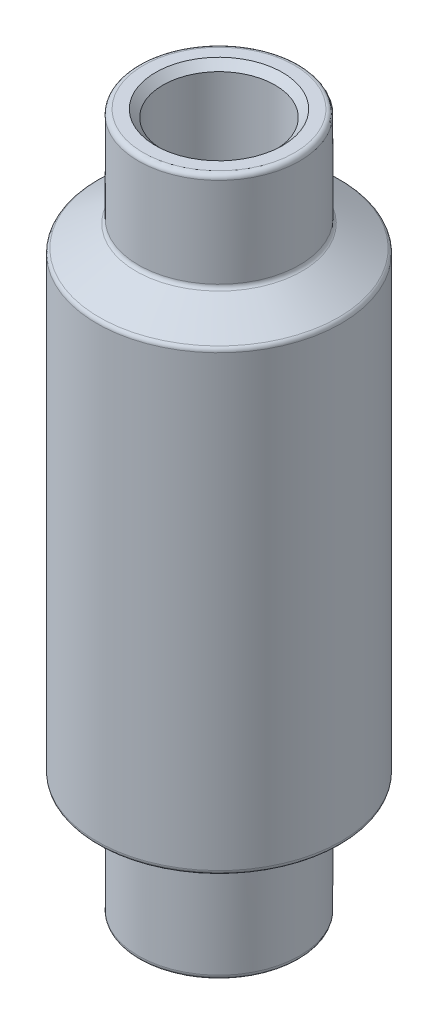
ISO-10303-21;
HEADER;
FILE_DESCRIPTION(('STEP AP214'),'2;1');
FILE_NAME('part.step','',(''),(''),'','','');
FILE_SCHEMA(('AUTOMOTIVE_DESIGN { 1 0 10303 214 1 1 1 1 }'));
ENDSEC;
DATA;
#1=APPLICATION_CONTEXT('core data for automotive mechanical design processes');
#2=APPLICATION_PROTOCOL_DEFINITION('international standard','automotive_design',2000,#1);
#3=PRODUCT_CONTEXT('',#1,'mechanical');
#4=PRODUCT('Part','Part','',(#3));
#5=PRODUCT_RELATED_PRODUCT_CATEGORY('part','',(#4));
#6=PRODUCT_DEFINITION_FORMATION('','',#4);
#7=PRODUCT_DEFINITION_CONTEXT('part definition',#1,'design');
#8=PRODUCT_DEFINITION('design','',#6,#7);
#9=PRODUCT_DEFINITION_SHAPE('','',#8);
#10=(LENGTH_UNIT() NAMED_UNIT(*) SI_UNIT(.MILLI.,.METRE.));
#11=(NAMED_UNIT(*) PLANE_ANGLE_UNIT() SI_UNIT($,.RADIAN.));
#12=(NAMED_UNIT(*) SI_UNIT($,.STERADIAN.) SOLID_ANGLE_UNIT());
#13=UNCERTAINTY_MEASURE_WITH_UNIT(LENGTH_MEASURE(1.E-05),#10,'distance_accuracy_value','');
#14=(GEOMETRIC_REPRESENTATION_CONTEXT(3) GLOBAL_UNCERTAINTY_ASSIGNED_CONTEXT((#13)) GLOBAL_UNIT_ASSIGNED_CONTEXT((#10,
#11,#12)) REPRESENTATION_CONTEXT('',''));
#15=CARTESIAN_POINT('',(0.,0.,0.));
#16=DIRECTION('',(0.,0.,1.));
#17=DIRECTION('',(1.,0.,0.));
#18=AXIS2_PLACEMENT_3D('',#15,#16,#17);
#19=CARTESIAN_POINT('',(0.,-71.5,0.));
#20=DIRECTION('',(0.,-1.,0.));
#21=DIRECTION('',(1.,0.,0.));
#22=AXIS2_PLACEMENT_3D('',#19,#20,#21);
#23=PLANE('',#22);
#24=CARTESIAN_POINT('',(0.,-71.5,0.));
#25=DIRECTION('',(0.,-1.,0.));
#26=DIRECTION('',(1.,0.,0.));
#27=AXIS2_PLACEMENT_3D('',#24,#25,#26);
#28=CIRCLE('',#27,13.);
#29=CARTESIAN_POINT('',(13.,-71.5,0.));
#30=VERTEX_POINT('',#29);
#31=EDGE_CURVE('E47',#30,#30,#28,.F.);
#32=ORIENTED_EDGE('',*,*,#31,.T.);
#33=EDGE_LOOP('',(#32));
#34=FACE_BOUND('',#33,.T.);
#35=CARTESIAN_POINT('',(0.,-71.5,0.));
#36=DIRECTION('',(0.,-1.,0.));
#37=DIRECTION('',(1.,0.,0.));
#38=AXIS2_PLACEMENT_3D('',#35,#36,#37);
#39=CIRCLE('',#38,15.5);
#40=CARTESIAN_POINT('',(15.5,-71.5,0.));
#41=VERTEX_POINT('',#40);
#42=EDGE_CURVE('E58',#41,#41,#39,.T.);
#43=ORIENTED_EDGE('',*,*,#42,.T.);
#44=EDGE_LOOP('',(#43));
#45=FACE_BOUND('',#44,.T.);
#46=ADVANCED_FACE('F32',(#34,#45),#23,.T.);
#47=CARTESIAN_POINT('',(0.,71.5,0.));
#48=DIRECTION('',(0.,1.,0.));
#49=DIRECTION('',(-1.,0.,0.));
#50=AXIS2_PLACEMENT_3D('',#47,#48,#49);
#51=CYLINDRICAL_SURFACE('',#50,16.5);
#52=CARTESIAN_POINT('',(0.,-70.5,0.));
#53=DIRECTION('',(0.,-1.,0.));
#54=DIRECTION('',(1.,0.,0.));
#55=AXIS2_PLACEMENT_3D('',#52,#53,#54);
#56=CIRCLE('',#55,16.5);
#57=CARTESIAN_POINT('',(16.5,-70.5,0.));
#58=VERTEX_POINT('',#57);
#59=EDGE_CURVE('E61',#58,#58,#56,.F.);
#60=ORIENTED_EDGE('',*,*,#59,.T.);
#61=EDGE_LOOP('',(#60));
#62=FACE_BOUND('',#61,.T.);
#63=CARTESIAN_POINT('',(0.,-52.0719460543127,0.));
#64=DIRECTION('',(0.,1.,0.));
#65=DIRECTION('',(-1.,0.,0.));
#66=AXIS2_PLACEMENT_3D('',#63,#64,#65);
#67=CIRCLE('',#66,16.5);
#68=CARTESIAN_POINT('',(-16.5000000000001,-52.0719460543127,0.));
#69=VERTEX_POINT('',#68);
#70=EDGE_CURVE('E67',#69,#69,#67,.F.);
#71=ORIENTED_EDGE('',*,*,#70,.T.);
#72=EDGE_LOOP('',(#71));
#73=FACE_BOUND('',#72,.T.);
#74=ADVANCED_FACE('F112',(#62,#73),#51,.T.);
#75=CARTESIAN_POINT('',(0.,-51.5,0.));
#76=DIRECTION('',(0.,1.,0.));
#77=DIRECTION('',(-1.,0.,0.));
#78=AXIS2_PLACEMENT_3D('',#75,#76,#77);
#79=CONICAL_SURFACE('',#78,16.5,1.03907225953609);
#80=CARTESIAN_POINT('',(0.,-51.2100118391549,0.));
#81=DIRECTION('',(0.,-1.,0.));
#82=DIRECTION('',(1.,0.,0.));
#83=AXIS2_PLACEMENT_3D('',#80,#81,#82);
#84=CIRCLE('',#83,16.9929798734366);
#85=CARTESIAN_POINT('',(16.9929798734366,-51.2100118391549,0.));
#86=VERTEX_POINT('',#85);
#87=EDGE_CURVE('E70',#86,#86,#84,.F.);
#88=ORIENTED_EDGE('',*,*,#87,.T.);
#89=EDGE_LOOP('',(#88));
#90=FACE_BOUND('',#89,.T.);
#91=CARTESIAN_POINT('',(0.,-46.7899881608451,0.));
#92=DIRECTION('',(0.,1.,0.));
#93=DIRECTION('',(-1.,0.,0.));
#94=AXIS2_PLACEMENT_3D('',#91,#92,#93);
#95=CIRCLE('',#94,24.5070201265634);
#96=CARTESIAN_POINT('',(-24.5070201265634,-46.7899881608451,0.));
#97=VERTEX_POINT('',#96);
#98=EDGE_CURVE('E73',#97,#97,#95,.F.);
#99=ORIENTED_EDGE('',*,*,#98,.T.);
#100=EDGE_LOOP('',(#99));
#101=FACE_BOUND('',#100,.T.);
#102=ADVANCED_FACE('F118',(#90,#101),#79,.T.);
#103=CARTESIAN_POINT('',(0.,71.5,0.));
#104=DIRECTION('',(0.,1.,0.));
#105=DIRECTION('',(-1.,0.,0.));
#106=AXIS2_PLACEMENT_3D('',#103,#104,#105);
#107=CYLINDRICAL_SURFACE('',#106,25.);
#108=CARTESIAN_POINT('',(0.,-45.9280539456873,0.));
#109=DIRECTION('',(0.,-1.,0.));
#110=DIRECTION('',(1.,0.,0.));
#111=AXIS2_PLACEMENT_3D('',#108,#109,#110);
#112=CIRCLE('',#111,25.);
#113=CARTESIAN_POINT('',(25.,-45.9280539456873,0.));
#114=VERTEX_POINT('',#113);
#115=EDGE_CURVE('E64',#114,#114,#112,.F.);
#116=ORIENTED_EDGE('',*,*,#115,.T.);
#117=EDGE_LOOP('',(#116));
#118=FACE_BOUND('',#117,.T.);
#119=CARTESIAN_POINT('',(0.,45.9280539456873,0.));
#120=DIRECTION('',(0.,-1.,0.));
#121=DIRECTION('',(1.,0.,0.));
#122=AXIS2_PLACEMENT_3D('',#119,#120,#121);
#123=CIRCLE('',#122,25.);
#124=CARTESIAN_POINT('',(25.,45.9280539456873,0.));
#125=VERTEX_POINT('',#124);
#126=EDGE_CURVE('E82',#125,#125,#123,.T.);
#127=ORIENTED_EDGE('',*,*,#126,.T.);
#128=EDGE_LOOP('',(#127));
#129=FACE_BOUND('',#128,.T.);
#130=ADVANCED_FACE('F241',(#118,#129),#107,.T.);
#131=CARTESIAN_POINT('',(0.,51.5,0.));
#132=DIRECTION('',(0.,-1.,0.));
#133=DIRECTION('',(1.,0.,0.));
#134=AXIS2_PLACEMENT_3D('',#131,#132,#133);
#135=CONICAL_SURFACE('',#134,16.5,1.03907225953609);
#136=CARTESIAN_POINT('',(0.,51.2100118391549,0.));
#137=DIRECTION('',(0.,1.,0.));
#138=DIRECTION('',(-1.,0.,0.));
#139=AXIS2_PLACEMENT_3D('',#136,#137,#138);
#140=CIRCLE('',#139,16.9929798734366);
#141=CARTESIAN_POINT('',(-16.9929798734366,51.2100118391549,0.));
#142=VERTEX_POINT('',#141);
#143=EDGE_CURVE('E76',#142,#142,#140,.F.);
#144=ORIENTED_EDGE('',*,*,#143,.T.);
#145=EDGE_LOOP('',(#144));
#146=FACE_BOUND('',#145,.T.);
#147=CARTESIAN_POINT('',(0.,46.7899881608451,0.));
#148=DIRECTION('',(0.,1.,0.));
#149=DIRECTION('',(-1.,0.,0.));
#150=AXIS2_PLACEMENT_3D('',#147,#148,#149);
#151=CIRCLE('',#150,24.5070201265634);
#152=CARTESIAN_POINT('',(-24.5070201265634,46.7899881608451,0.));
#153=VERTEX_POINT('',#152);
#154=EDGE_CURVE('E85',#153,#153,#151,.T.);
#155=ORIENTED_EDGE('',*,*,#154,.T.);
#156=EDGE_LOOP('',(#155));
#157=FACE_BOUND('',#156,.T.);
#158=ADVANCED_FACE('F213',(#146,#157),#135,.T.);
#159=CARTESIAN_POINT('',(0.,71.5,0.));
#160=DIRECTION('',(0.,1.,0.));
#161=DIRECTION('',(-1.,0.,0.));
#162=AXIS2_PLACEMENT_3D('',#159,#160,#161);
#163=CYLINDRICAL_SURFACE('',#162,16.5);
#164=CARTESIAN_POINT('',(0.,70.5,0.));
#165=DIRECTION('',(0.,-1.,0.));
#166=DIRECTION('',(1.,0.,0.));
#167=AXIS2_PLACEMENT_3D('',#164,#165,#166);
#168=CIRCLE('',#167,16.5);
#169=CARTESIAN_POINT('',(16.5,70.5,0.));
#170=VERTEX_POINT('',#169);
#171=EDGE_CURVE('E52',#170,#170,#168,.T.);
#172=ORIENTED_EDGE('',*,*,#171,.T.);
#173=EDGE_LOOP('',(#172));
#174=FACE_BOUND('',#173,.T.);
#175=CARTESIAN_POINT('',(0.,52.0719460543127,0.));
#176=DIRECTION('',(0.,1.,0.));
#177=DIRECTION('',(-1.,0.,0.));
#178=AXIS2_PLACEMENT_3D('',#175,#176,#177);
#179=CIRCLE('',#178,16.5);
#180=CARTESIAN_POINT('',(-16.5,52.0719460543127,0.));
#181=VERTEX_POINT('',#180);
#182=EDGE_CURVE('E79',#181,#181,#179,.T.);
#183=ORIENTED_EDGE('',*,*,#182,.T.);
#184=EDGE_LOOP('',(#183));
#185=FACE_BOUND('',#184,.T.);
#186=ADVANCED_FACE('F188',(#174,#185),#163,.T.);
#187=CARTESIAN_POINT('',(0.,71.5,0.));
#188=DIRECTION('',(0.,-1.,0.));
#189=DIRECTION('',(1.,0.,0.));
#190=AXIS2_PLACEMENT_3D('',#187,#188,#189);
#191=PLANE('',#190);
#192=CARTESIAN_POINT('',(0.,71.5,0.));
#193=DIRECTION('',(0.,-1.,0.));
#194=DIRECTION('',(1.,0.,0.));
#195=AXIS2_PLACEMENT_3D('',#192,#193,#194);
#196=CIRCLE('',#195,13.);
#197=CARTESIAN_POINT('',(13.,71.5,0.));
#198=VERTEX_POINT('',#197);
#199=EDGE_CURVE('E10',#198,#198,#196,.T.);
#200=ORIENTED_EDGE('',*,*,#199,.T.);
#201=EDGE_LOOP('',(#200));
#202=FACE_BOUND('',#201,.T.);
#203=CARTESIAN_POINT('',(0.,71.5,0.));
#204=DIRECTION('',(0.,-1.,0.));
#205=DIRECTION('',(1.,0.,0.));
#206=AXIS2_PLACEMENT_3D('',#203,#204,#205);
#207=CIRCLE('',#206,15.5);
#208=CARTESIAN_POINT('',(15.5,71.5,0.));
#209=VERTEX_POINT('',#208);
#210=EDGE_CURVE('E55',#209,#209,#207,.F.);
#211=ORIENTED_EDGE('',*,*,#210,.T.);
#212=EDGE_LOOP('',(#211));
#213=FACE_BOUND('',#212,.T.);
#214=ADVANCED_FACE('F179',(#202,#213),#191,.F.);
#215=CARTESIAN_POINT('',(0.,37.5,0.));
#216=DIRECTION('',(0.,1.,0.));
#217=DIRECTION('',(-1.,0.,0.));
#218=AXIS2_PLACEMENT_3D('',#215,#216,#217);
#219=CYLINDRICAL_SURFACE('',#218,11.5);
#220=CARTESIAN_POINT('',(0.,70.,0.));
#221=DIRECTION('',(0.,-1.,0.));
#222=DIRECTION('',(1.,0.,0.));
#223=AXIS2_PLACEMENT_3D('',#220,#221,#222);
#224=CIRCLE('',#223,11.5);
#225=CARTESIAN_POINT('',(11.5,70.,0.));
#226=VERTEX_POINT('',#225);
#227=EDGE_CURVE('E39',#226,#226,#224,.F.);
#228=ORIENTED_EDGE('',*,*,#227,.T.);
#229=EDGE_LOOP('',(#228));
#230=FACE_BOUND('',#229,.T.);
#231=CARTESIAN_POINT('',(0.,37.5,0.));
#232=DIRECTION('',(0.,1.,0.));
#233=DIRECTION('',(-1.,0.,0.));
#234=AXIS2_PLACEMENT_3D('',#231,#232,#233);
#235=CIRCLE('',#234,11.5);
#236=CARTESIAN_POINT('',(-11.5,37.5,0.));
#237=VERTEX_POINT('',#236);
#238=EDGE_CURVE('E88',#237,#237,#235,.T.);
#239=ORIENTED_EDGE('',*,*,#238,.F.);
#240=EDGE_LOOP('',(#239));
#241=FACE_BOUND('',#240,.T.);
#242=ADVANCED_FACE('F174',(#230,#241),#219,.F.);
#243=CARTESIAN_POINT('',(0.,37.5,0.));
#244=DIRECTION('',(0.,1.,0.));
#245=DIRECTION('',(-1.,0.,0.));
#246=AXIS2_PLACEMENT_3D('',#243,#244,#245);
#247=PLANE('',#246);
#248=ORIENTED_EDGE('',*,*,#238,.T.);
#249=EDGE_LOOP('',(#248));
#250=FACE_BOUND('',#249,.T.);
#251=ADVANCED_FACE('F108',(#250),#247,.T.);
#252=CARTESIAN_POINT('',(0.,-37.5,0.));
#253=DIRECTION('',(0.,-1.,0.));
#254=DIRECTION('',(1.,0.,0.));
#255=AXIS2_PLACEMENT_3D('',#252,#253,#254);
#256=CYLINDRICAL_SURFACE('',#255,11.5);
#257=CARTESIAN_POINT('',(0.,-70.,0.));
#258=DIRECTION('',(0.,-1.,0.));
#259=DIRECTION('',(1.,0.,0.));
#260=AXIS2_PLACEMENT_3D('',#257,#258,#259);
#261=CIRCLE('',#260,11.5);
#262=CARTESIAN_POINT('',(11.5,-70.,0.));
#263=VERTEX_POINT('',#262);
#264=EDGE_CURVE('E43',#263,#263,#261,.T.);
#265=ORIENTED_EDGE('',*,*,#264,.T.);
#266=EDGE_LOOP('',(#265));
#267=FACE_BOUND('',#266,.T.);
#268=CARTESIAN_POINT('',(0.,-37.5,0.));
#269=DIRECTION('',(0.,1.,0.));
#270=DIRECTION('',(-1.,0.,0.));
#271=AXIS2_PLACEMENT_3D('',#268,#269,#270);
#272=CIRCLE('',#271,11.5);
#273=CARTESIAN_POINT('',(-11.5,-37.5,0.));
#274=VERTEX_POINT('',#273);
#275=EDGE_CURVE('E91',#274,#274,#272,.T.);
#276=ORIENTED_EDGE('',*,*,#275,.T.);
#277=EDGE_LOOP('',(#276));
#278=FACE_BOUND('',#277,.T.);
#279=ADVANCED_FACE('F95',(#267,#278),#256,.F.);
#280=CARTESIAN_POINT('',(0.,-37.5,0.));
#281=DIRECTION('',(0.,-1.,0.));
#282=DIRECTION('',(-1.,0.,0.));
#283=AXIS2_PLACEMENT_3D('',#280,#281,#282);
#284=PLANE('',#283);
#285=ORIENTED_EDGE('',*,*,#275,.F.);
#286=EDGE_LOOP('',(#285));
#287=FACE_BOUND('',#286,.T.);
#288=ADVANCED_FACE('F97',(#287),#284,.T.);
#289=CARTESIAN_POINT('',(0.,45.9280539456873,0.));
#290=DIRECTION('',(0.,-1.,0.));
#291=DIRECTION('',(1.,0.,0.));
#292=AXIS2_PLACEMENT_3D('',#289,#290,#291);
#293=TOROIDAL_SURFACE('',#292,24.,1.);
#294=ORIENTED_EDGE('',*,*,#126,.F.);
#295=EDGE_LOOP('',(#294));
#296=FACE_BOUND('',#295,.T.);
#297=ORIENTED_EDGE('',*,*,#154,.F.);
#298=EDGE_LOOP('',(#297));
#299=FACE_BOUND('',#298,.T.);
#300=ADVANCED_FACE('F99',(#296,#299),#293,.T.);
#301=CARTESIAN_POINT('',(0.,52.0719460543127,0.));
#302=DIRECTION('',(0.,1.,0.));
#303=DIRECTION('',(-1.,0.,0.));
#304=AXIS2_PLACEMENT_3D('',#301,#302,#303);
#305=TOROIDAL_SURFACE('',#304,17.5,1.);
#306=ORIENTED_EDGE('',*,*,#143,.F.);
#307=EDGE_LOOP('',(#306));
#308=FACE_BOUND('',#307,.T.);
#309=ORIENTED_EDGE('',*,*,#182,.F.);
#310=EDGE_LOOP('',(#309));
#311=FACE_BOUND('',#310,.T.);
#312=ADVANCED_FACE('F105',(#308,#311),#305,.F.);
#313=CARTESIAN_POINT('',(0.,-52.0719460543127,0.));
#314=DIRECTION('',(0.,1.,0.));
#315=DIRECTION('',(-1.,0.,0.));
#316=AXIS2_PLACEMENT_3D('',#313,#314,#315);
#317=TOROIDAL_SURFACE('',#316,17.5,1.);
#318=ORIENTED_EDGE('',*,*,#70,.F.);
#319=EDGE_LOOP('',(#318));
#320=FACE_BOUND('',#319,.T.);
#321=ORIENTED_EDGE('',*,*,#87,.F.);
#322=EDGE_LOOP('',(#321));
#323=FACE_BOUND('',#322,.T.);
#324=ADVANCED_FACE('F126',(#320,#323),#317,.F.);
#325=CARTESIAN_POINT('',(0.,-45.9280539456873,0.));
#326=DIRECTION('',(0.,-1.,0.));
#327=DIRECTION('',(1.,0.,0.));
#328=AXIS2_PLACEMENT_3D('',#325,#326,#327);
#329=TOROIDAL_SURFACE('',#328,24.,1.);
#330=ORIENTED_EDGE('',*,*,#98,.F.);
#331=EDGE_LOOP('',(#330));
#332=FACE_BOUND('',#331,.T.);
#333=ORIENTED_EDGE('',*,*,#115,.F.);
#334=EDGE_LOOP('',(#333));
#335=FACE_BOUND('',#334,.T.);
#336=ADVANCED_FACE('F130',(#332,#335),#329,.T.);
#337=CARTESIAN_POINT('',(0.,-70.5,0.));
#338=DIRECTION('',(0.,-1.,0.));
#339=DIRECTION('',(1.,0.,0.));
#340=AXIS2_PLACEMENT_3D('',#337,#338,#339);
#341=TOROIDAL_SURFACE('',#340,15.5,1.);
#342=ORIENTED_EDGE('',*,*,#42,.F.);
#343=EDGE_LOOP('',(#342));
#344=FACE_BOUND('',#343,.T.);
#345=ORIENTED_EDGE('',*,*,#59,.F.);
#346=EDGE_LOOP('',(#345));
#347=FACE_BOUND('',#346,.T.);
#348=ADVANCED_FACE('F134',(#344,#347),#341,.T.);
#349=CARTESIAN_POINT('',(0.,70.5,0.));
#350=DIRECTION('',(0.,-1.,0.));
#351=DIRECTION('',(1.,0.,0.));
#352=AXIS2_PLACEMENT_3D('',#349,#350,#351);
#353=TOROIDAL_SURFACE('',#352,15.5,1.);
#354=ORIENTED_EDGE('',*,*,#171,.F.);
#355=EDGE_LOOP('',(#354));
#356=FACE_BOUND('',#355,.T.);
#357=ORIENTED_EDGE('',*,*,#210,.F.);
#358=EDGE_LOOP('',(#357));
#359=FACE_BOUND('',#358,.T.);
#360=ADVANCED_FACE('F138',(#356,#359),#353,.T.);
#361=CARTESIAN_POINT('',(0.,-71.5,0.));
#362=DIRECTION('',(0.,-1.,0.));
#363=DIRECTION('',(1.,0.,0.));
#364=AXIS2_PLACEMENT_3D('',#361,#362,#363);
#365=CONICAL_SURFACE('',#364,13.,0.785398163397443);
#366=ORIENTED_EDGE('',*,*,#264,.F.);
#367=EDGE_LOOP('',(#366));
#368=FACE_BOUND('',#367,.T.);
#369=ORIENTED_EDGE('',*,*,#31,.F.);
#370=EDGE_LOOP('',(#369));
#371=FACE_BOUND('',#370,.T.);
#372=ADVANCED_FACE('F141',(#368,#371),#365,.F.);
#373=CARTESIAN_POINT('',(0.,70.,0.));
#374=DIRECTION('',(0.,1.,0.));
#375=DIRECTION('',(-1.,0.,0.));
#376=AXIS2_PLACEMENT_3D('',#373,#374,#375);
#377=CONICAL_SURFACE('',#376,11.5,0.785398163397451);
#378=ORIENTED_EDGE('',*,*,#199,.F.);
#379=EDGE_LOOP('',(#378));
#380=FACE_BOUND('',#379,.T.);
#381=ORIENTED_EDGE('',*,*,#227,.F.);
#382=EDGE_LOOP('',(#381));
#383=FACE_BOUND('',#382,.T.);
#384=ADVANCED_FACE('F34',(#380,#383),#377,.F.);
#385=CLOSED_SHELL('',(#46,#74,#102,#130,#158,#186,#214,#242,#251,#279,#288,#300,#312,#324,#336,
#348,#360,#372,#384));
#386=MANIFOLD_SOLID_BREP('B2',#385);
#387=ADVANCED_BREP_SHAPE_REPRESENTATION('',(#18,#386),#14);
#388=SHAPE_DEFINITION_REPRESENTATION(#9,#387);
ENDSEC;
END-ISO-10303-21;
